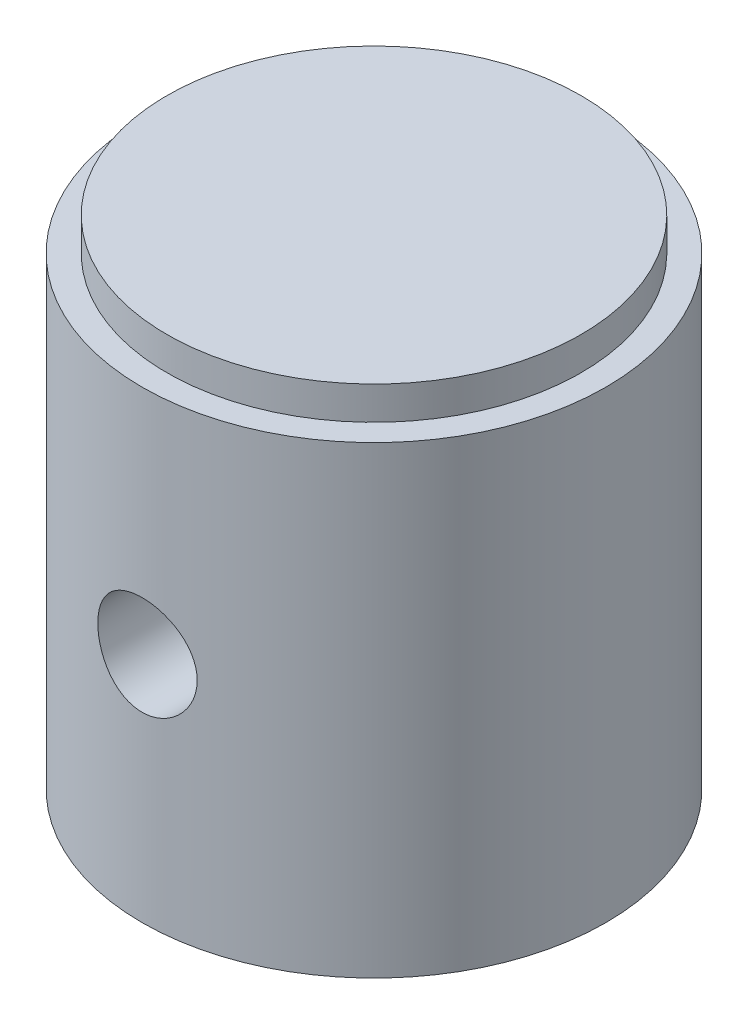
ISO-10303-21;
HEADER;
FILE_DESCRIPTION(('STEP AP214'),'2;1');
FILE_NAME('part.step','',(''),(''),'','','');
FILE_SCHEMA(('AUTOMOTIVE_DESIGN { 1 0 10303 214 1 1 1 1 }'));
ENDSEC;
DATA;
#1=APPLICATION_CONTEXT('core data for automotive mechanical design processes');
#2=APPLICATION_PROTOCOL_DEFINITION('international standard','automotive_design',2000,#1);
#3=PRODUCT_CONTEXT('',#1,'mechanical');
#4=PRODUCT('Part','Part','',(#3));
#5=PRODUCT_RELATED_PRODUCT_CATEGORY('part','',(#4));
#6=PRODUCT_DEFINITION_FORMATION('','',#4);
#7=PRODUCT_DEFINITION_CONTEXT('part definition',#1,'design');
#8=PRODUCT_DEFINITION('design','',#6,#7);
#9=PRODUCT_DEFINITION_SHAPE('','',#8);
#10=(LENGTH_UNIT() NAMED_UNIT(*) SI_UNIT(.MILLI.,.METRE.));
#11=(NAMED_UNIT(*) PLANE_ANGLE_UNIT() SI_UNIT($,.RADIAN.));
#12=(NAMED_UNIT(*) SI_UNIT($,.STERADIAN.) SOLID_ANGLE_UNIT());
#13=UNCERTAINTY_MEASURE_WITH_UNIT(LENGTH_MEASURE(1.E-05),#10,'distance_accuracy_value','');
#14=(GEOMETRIC_REPRESENTATION_CONTEXT(3) GLOBAL_UNCERTAINTY_ASSIGNED_CONTEXT((#13)) GLOBAL_UNIT_ASSIGNED_CONTEXT((#10,
#11,#12)) REPRESENTATION_CONTEXT('',''));
#15=CARTESIAN_POINT('',(0.,0.,0.));
#16=DIRECTION('',(0.,0.,1.));
#17=DIRECTION('',(1.,0.,0.));
#18=AXIS2_PLACEMENT_3D('',#15,#16,#17);
#19=CARTESIAN_POINT('',(9.16749727962461E-07,6.80628912748792,1.67112240708691E-06));
#20=DIRECTION('',(0.,-1.,0.));
#21=DIRECTION('',(0.,0.,-1.));
#22=AXIS2_PLACEMENT_3D('',#19,#20,#21);
#23=CONICAL_SURFACE('',#22,7.125,1.02974425867666);
#24=CARTESIAN_POINT('',(9.16749727962461E-07,11.0874210380593,1.67112240708691E-06));
#25=VERTEX_POINT('',#24);
#26=VERTEX_LOOP('',#25);
#27=FACE_BOUND('',#26,.T.);
#28=CARTESIAN_POINT('',(9.16749727962461E-07,6.80628912748792,1.67112240708691E-06));
#29=DIRECTION('',(0.,-1.,0.));
#30=DIRECTION('',(0.,0.,-1.));
#31=AXIS2_PLACEMENT_3D('',#28,#29,#30);
#32=CIRCLE('',#31,7.125);
#33=CARTESIAN_POINT('',(9.16749727962461E-07,6.80628912748792,-7.12499832887759));
#34=VERTEX_POINT('',#33);
#35=EDGE_CURVE('E68',#34,#34,#32,.T.);
#36=ORIENTED_EDGE('',*,*,#35,.T.);
#37=EDGE_LOOP('',(#36));
#38=FACE_BOUND('',#37,.T.);
#39=ADVANCED_FACE('F47',(#27,#38),#23,.F.);
#40=CARTESIAN_POINT('',(9.1674972860878E-07,12.8062891274879,1.67112240708691E-06));
#41=DIRECTION('',(0.,-1.,0.));
#42=DIRECTION('',(0.,0.,-1.));
#43=AXIS2_PLACEMENT_3D('',#40,#41,#42);
#44=PLANE('',#43);
#45=CARTESIAN_POINT('',(9.16749727962461E-07,12.8062891274879,1.67112240708691E-06));
#46=DIRECTION('',(0.,-1.,0.));
#47=DIRECTION('',(0.,0.,-1.));
#48=AXIS2_PLACEMENT_3D('',#45,#46,#47);
#49=CIRCLE('',#48,9.375);
#50=CARTESIAN_POINT('',(9.16749727962461E-07,12.8062891274879,-9.3749983288776));
#51=VERTEX_POINT('',#50);
#52=EDGE_CURVE('E13',#51,#51,#49,.T.);
#53=ORIENTED_EDGE('',*,*,#52,.F.);
#54=EDGE_LOOP('',(#53));
#55=FACE_BOUND('',#54,.T.);
#56=ADVANCED_FACE('F65',(#55),#44,.F.);
#57=CARTESIAN_POINT('',(9.16749727962461E-07,1.86934394232052,1.67112240708691E-06));
#58=DIRECTION('',(0.,-1.,0.));
#59=DIRECTION('',(0.,0.,-1.));
#60=AXIS2_PLACEMENT_3D('',#57,#58,#59);
#61=CYLINDRICAL_SURFACE('',#60,9.375);
#62=CARTESIAN_POINT('',(9.16749727962461E-07,11.3062891274879,1.67112240708691E-06));
#63=DIRECTION('',(0.,-1.,0.));
#64=DIRECTION('',(0.,0.,-1.));
#65=AXIS2_PLACEMENT_3D('',#62,#63,#64);
#66=CIRCLE('',#65,9.375);
#67=CARTESIAN_POINT('',(9.16749727962461E-07,11.3062891274879,-9.37499832887759));
#68=VERTEX_POINT('',#67);
#69=EDGE_CURVE('E59',#68,#68,#66,.T.);
#70=ORIENTED_EDGE('',*,*,#69,.F.);
#71=EDGE_LOOP('',(#70));
#72=FACE_BOUND('',#71,.T.);
#73=ORIENTED_EDGE('',*,*,#52,.T.);
#74=EDGE_LOOP('',(#73));
#75=FACE_BOUND('',#74,.T.);
#76=ADVANCED_FACE('F125',(#72,#75),#61,.T.);
#77=CARTESIAN_POINT('',(-9.37499908325027,11.3062891274879,1.67112240708691E-06));
#78=DIRECTION('',(0.,-1.,0.));
#79=DIRECTION('',(0.,0.,-1.));
#80=AXIS2_PLACEMENT_3D('',#77,#78,#79);
#81=PLANE('',#80);
#82=CARTESIAN_POINT('',(9.16749727962461E-07,11.3062891274879,1.67112240708691E-06));
#83=DIRECTION('',(0.,-1.,0.));
#84=DIRECTION('',(0.,0.,-1.));
#85=AXIS2_PLACEMENT_3D('',#82,#83,#84);
#86=CIRCLE('',#85,10.5);
#87=CARTESIAN_POINT('',(9.16749727962461E-07,11.3062891274879,-10.4999983288776));
#88=VERTEX_POINT('',#87);
#89=EDGE_CURVE('E90',#88,#88,#86,.T.);
#90=ORIENTED_EDGE('',*,*,#89,.F.);
#91=EDGE_LOOP('',(#90));
#92=FACE_BOUND('',#91,.T.);
#93=ORIENTED_EDGE('',*,*,#69,.T.);
#94=EDGE_LOOP('',(#93));
#95=FACE_BOUND('',#94,.T.);
#96=ADVANCED_FACE('F120',(#92,#95),#81,.F.);
#97=CARTESIAN_POINT('',(9.16749727962461E-07,1.86934394232052,1.67112240708691E-06));
#98=DIRECTION('',(0.,-1.,0.));
#99=DIRECTION('',(0.,0.,-1.));
#100=AXIS2_PLACEMENT_3D('',#97,#98,#99);
#101=CYLINDRICAL_SURFACE('',#100,10.5);
#102=CARTESIAN_POINT('',(9.16749727962461E-07,3.05628912748792,-10.4999983288776));
#103=CARTESIAN_POINT('',(-0.124852912386197,3.05628477812647,-10.499996019526));
#104=CARTESIAN_POINT('',(-0.249759876650684,3.04586171490614,-10.4977487181233));
#105=CARTESIAN_POINT('',(-0.496030099690263,3.00448564220754,-10.4890007762935));
#106=CARTESIAN_POINT('',(-0.617390688607057,2.97351756119552,-10.4824970134341));
#107=CARTESIAN_POINT('',(-0.852973068976877,2.89206258057587,-10.46596080571));
#108=CARTESIAN_POINT('',(-0.967202028420106,2.84159565841594,-10.4559319733852));
#109=CARTESIAN_POINT('',(-1.18556635019145,2.72263799823103,-10.4334299311472));
#110=CARTESIAN_POINT('',(-1.28970205587133,2.65414787361301,-10.4209568044275));
#111=CARTESIAN_POINT('',(-1.48653626905312,2.49996867797766,-10.3947188675723));
#112=CARTESIAN_POINT('',(-1.57905663454195,2.41405479464013,-10.3809385760265));
#113=CARTESIAN_POINT('',(-1.7484897190918,2.22794965396013,-10.3537493760898));
#114=CARTESIAN_POINT('',(-1.8254010905139,2.12775716511104,-10.340340499852));
#115=CARTESIAN_POINT('',(-1.9622121489474,1.91463049819727,-10.315260069586));
#116=CARTESIAN_POINT('',(-2.0219234582754,1.80157285085361,-10.303608374043));
#117=CARTESIAN_POINT('',(-2.12143143861749,1.56673744683767,-10.2835832122556));
#118=CARTESIAN_POINT('',(-2.16123038827601,1.44496068974906,-10.2752093709383));
#119=CARTESIAN_POINT('',(-2.21919769958709,1.19807249760581,-10.2628454627723));
#120=CARTESIAN_POINT('',(-2.23768077947541,1.07303821399213,-10.2587916823249));
#121=CARTESIAN_POINT('',(-2.25347001134893,0.821582778727431,-10.2553354265542));
#122=CARTESIAN_POINT('',(-2.25077865821971,0.695161792218003,-10.2559324032535));
#123=CARTESIAN_POINT('',(-2.22454897836319,0.446852095587235,-10.2616524779351));
#124=CARTESIAN_POINT('',(-2.2013750629914,0.324922793837693,-10.26669645411));
#125=CARTESIAN_POINT('',(-2.13541489773042,0.0867237670539105,-10.2806172295144));
#126=CARTESIAN_POINT('',(-2.09262758729726,-0.0295456515605576,-10.2894942360036));
#127=CARTESIAN_POINT('',(-1.98831734939014,-0.254155181822084,-10.3101595402135));
#128=CARTESIAN_POINT('',(-1.92665324784272,-0.362427641580903,-10.3219696436281));
#129=CARTESIAN_POINT('',(-1.78643919251017,-0.567223619949012,-10.3471569163969));
#130=CARTESIAN_POINT('',(-1.7078870248037,-0.66374559554138,-10.360534291106));
#131=CARTESIAN_POINT('',(-1.53419222458008,-0.844399906022173,-10.3876891047858));
#132=CARTESIAN_POINT('',(-1.43873943419689,-0.928233932389183,-10.4014690884603));
#133=CARTESIAN_POINT('',(-1.23497504265392,-1.07875147304657,-10.4276235913335));
#134=CARTESIAN_POINT('',(-1.12666322641337,-1.14543470041266,-10.4399980870172));
#135=CARTESIAN_POINT('',(-0.899899276325212,-1.25982689237247,-10.4619850068876));
#136=CARTESIAN_POINT('',(-0.781427471545496,-1.30749799137905,-10.4715919085279));
#137=CARTESIAN_POINT('',(-0.537903803278832,-1.3821743449937,-10.4869199675576));
#138=CARTESIAN_POINT('',(-0.412852859950776,-1.40918248135705,-10.4926416667833));
#139=CARTESIAN_POINT('',(-0.162280589505216,-1.44133519372721,-10.4994779240947));
#140=CARTESIAN_POINT('',(-0.0368138491576947,-1.44688744183475,-10.5006783766936));
#141=CARTESIAN_POINT('',(0.213254377225335,-1.43707401582433,-10.4985770629171));
#142=CARTESIAN_POINT('',(0.33785591894061,-1.42170970056767,-10.4952755890131));
#143=CARTESIAN_POINT('',(0.581314723723936,-1.37083750701952,-10.4845954745566));
#144=CARTESIAN_POINT('',(0.700218486112443,-1.33554231830328,-10.4772599045595));
#145=CARTESIAN_POINT('',(0.930418592459854,-1.24604545801985,-10.4593321952002));
#146=CARTESIAN_POINT('',(1.04171430563134,-1.1918422210446,-10.4487397862112));
#147=CARTESIAN_POINT('',(1.25523301369686,-1.06521055792159,-10.4252608947336));
#148=CARTESIAN_POINT('',(1.35730977941644,-0.992541180147486,-10.4123447991917));
#149=CARTESIAN_POINT('',(1.54796630503512,-0.831358635178973,-10.3857138244003));
#150=CARTESIAN_POINT('',(1.63654438478772,-0.742843498680913,-10.3719988460091));
#151=CARTESIAN_POINT('',(1.79929158261956,-0.550614817231373,-10.3450209194725));
#152=CARTESIAN_POINT('',(1.87317897557708,-0.446660723678922,-10.3317702121969));
#153=CARTESIAN_POINT('',(2.00244714754033,-0.227578977795088,-10.3074981472728));
#154=CARTESIAN_POINT('',(2.05782871545531,-0.112451802045839,-10.2964766945984));
#155=CARTESIAN_POINT('',(2.14814703547794,0.125097575979828,-10.2780134759884));
#156=CARTESIAN_POINT('',(2.18319689636885,0.247475162133925,-10.2705519476221));
#157=CARTESIAN_POINT('',(2.23219135802976,0.496562503238377,-10.2600161295039));
#158=CARTESIAN_POINT('',(2.24613917845359,0.623271594289902,-10.2569411704732));
#159=CARTESIAN_POINT('',(2.25240091564034,0.874587642250787,-10.2555676115999));
#160=CARTESIAN_POINT('',(2.24516112562439,0.99918314995879,-10.2571704766557));
#161=CARTESIAN_POINT('',(2.21024775784469,1.2453349906868,-10.26474977665));
#162=CARTESIAN_POINT('',(2.18257440111941,1.36689135656778,-10.2707261642783));
#163=CARTESIAN_POINT('',(2.10779110585623,1.60317711429168,-10.28633204544));
#164=CARTESIAN_POINT('',(2.06074362431303,1.71792710048436,-10.2959497922481));
#165=CARTESIAN_POINT('',(1.94860219068374,1.9379721862482,-10.3177597977373));
#166=CARTESIAN_POINT('',(1.88350644627222,2.04326634541049,-10.329952312083));
#167=CARTESIAN_POINT('',(1.73562527198928,2.24361641807597,-10.3558341627761));
#168=CARTESIAN_POINT('',(1.65252072806828,2.33843367140839,-10.3695479779615));
#169=CARTESIAN_POINT('',(1.47163074867916,2.51292352126861,-10.396760075873));
#170=CARTESIAN_POINT('',(1.37384193082812,2.59259261895623,-10.410258308147));
#171=CARTESIAN_POINT('',(1.1649056376528,2.73546306674627,-10.4357156946124));
#172=CARTESIAN_POINT('',(1.05360818576419,2.79844903683439,-10.447653797437));
#173=CARTESIAN_POINT('',(0.821776158160626,2.9047209208472,-10.4684357204379));
#174=CARTESIAN_POINT('',(0.701249575545548,2.94802366136548,-10.4772821820627));
#175=CARTESIAN_POINT('',(0.483803743079534,3.00581740518465,-10.4892710558042));
#176=CARTESIAN_POINT('',(0.388076725068697,3.02470877845797,-10.4932692072015));
#177=CARTESIAN_POINT('',(0.194910858030498,3.04994608005542,-10.4986336911984));
#178=CARTESIAN_POINT('',(0.0974720793828457,3.05629252295701,-10.5000001317473));
#179=CARTESIAN_POINT('',(9.16749727962461E-07,3.05628912748792,-10.4999983288776));
#180=B_SPLINE_CURVE_WITH_KNOTS('',3,(#102,#103,#104,#105,#106,#107,#108,#109,#110,#111,#112,
#113,#114,#115,#116,#117,#118,#119,#120,#121,#122,#123,#124,#125,#126,#127,#128,#129,#130,#131,
#132,#133,#134,#135,#136,#137,#138,#139,#140,#141,#142,#143,#144,#145,#146,#147,#148,#149,#150,
#151,#152,#153,#154,#155,#156,#157,#158,#159,#160,#161,#162,#163,#164,#165,#166,#167,#168,#169,
#170,#171,#172,#173,#174,#175,#176,#177,#178,#179),.UNSPECIFIED.,.T.,.F.,(4,2,2,2,2,2,2,2,2,2,2,
2,2,2,2,2,2,2,2,2,2,2,2,2,2,2,2,2,2,2,2,2,2,2,2,2,2,2,4),(0.,0.374204754768123,
0.748684324829904,1.1227812366384,1.49686541796883,1.87612442822598,2.2554161687776,
2.63871643821766,3.02197283516235,3.39949512186999,3.77697292753747,4.14786713179391,
4.51878139356852,4.89254034248952,5.26634831881334,5.64790516575436,6.02946839553525,
6.41178781709709,6.79405390884515,7.16901998556277,7.54396170347144,7.91497590883901,
8.28602083797651,8.66218100801704,9.03838795956727,9.42123094925301,9.80405761613708,
10.1847336061271,10.5653515084378,10.9380102081044,11.3106648766241,11.6821274956018,
12.0536270167743,12.4323442523117,12.8111488559567,13.1946286553583,13.5777800101541,
13.8699269869844,14.16206198006),.UNSPECIFIED.);
#181=CARTESIAN_POINT('',(9.16749727962461E-07,3.05628912748792,-10.4999983288776));
#182=VERTEX_POINT('',#181);
#183=EDGE_CURVE('E71',#182,#182,#180,.T.);
#184=ORIENTED_EDGE('',*,*,#183,.T.);
#185=EDGE_LOOP('',(#184));
#186=FACE_BOUND('',#185,.T.);
#187=CARTESIAN_POINT('',(2.25000091674973,0.806289127487923,10.2560974195054));
#188=CARTESIAN_POINT('',(2.24999654032988,0.681472398763402,10.2560999395313));
#189=CARTESIAN_POINT('',(2.2395794604215,0.556602466574315,10.258400756258));
#190=CARTESIAN_POINT('',(2.19822930554446,0.310409119125343,10.2673393475638));
#191=CARTESIAN_POINT('',(2.16728101155399,0.189088404473729,10.2739803392983));
#192=CARTESIAN_POINT('',(2.08588387201879,-0.0464094968734981,10.2908134005253));
#193=CARTESIAN_POINT('',(2.03545593161946,-0.160594189694306,10.3010016620103));
#194=CARTESIAN_POINT('',(1.91659018184982,-0.378883783428961,10.3237767338516));
#195=CARTESIAN_POINT('',(1.84815289748136,-0.482988978055682,10.3363634742854));
#196=CARTESIAN_POINT('',(1.69402805530305,-0.679855314735267,10.3627453530723));
#197=CARTESIAN_POINT('',(1.60810380900947,-0.772429186872021,10.3765554191987));
#198=CARTESIAN_POINT('',(1.42195517894409,-0.941966204120752,10.4036970467783));
#199=CARTESIAN_POINT('',(1.32172971207624,-1.01892816580218,10.4170285718936));
#200=CARTESIAN_POINT('',(1.1085718494466,-1.15579403924923,10.4418732077639));
#201=CARTESIAN_POINT('',(0.995521649094659,-1.215518356168,10.4533666534139));
#202=CARTESIAN_POINT('',(0.760702320763621,-1.31505240968151,10.4730717367664));
#203=CARTESIAN_POINT('',(0.638934132820197,-1.3548642896915,10.4812837276723));
#204=CARTESIAN_POINT('',(0.392081698256996,-1.41285582890909,10.4933951503401));
#205=CARTESIAN_POINT('',(0.267075017645114,-1.43135226534072,10.4973576717982));
#206=CARTESIAN_POINT('',(0.0156743347096955,-1.44717778848196,10.5007421042274));
#207=CARTESIAN_POINT('',(-0.11071951349741,-1.44450920335321,10.5001645146129));
#208=CARTESIAN_POINT('',(-0.359124627126039,-1.4183174255167,10.4945821840608));
#209=CARTESIAN_POINT('',(-0.48117375629344,-1.3951356220772,10.4896499184089));
#210=CARTESIAN_POINT('',(-0.719608279217855,-1.32911884973428,10.475994794959));
#211=CARTESIAN_POINT('',(-0.835993423512853,-1.28628301606247,10.4672717703702));
#212=CARTESIAN_POINT('',(-1.0607503295851,-1.1818686841793,10.4468979908253));
#213=CARTESIAN_POINT('',(-1.16905956877396,-1.12015972170556,10.4352269581816));
#214=CARTESIAN_POINT('',(-1.37391047309454,-0.97984792026668,10.4102385772804));
#215=CARTESIAN_POINT('',(-1.47045059292756,-0.901242866561625,10.3969210132928));
#216=CARTESIAN_POINT('',(-1.65105221525324,-0.727508055720281,10.3697915680363));
#217=CARTESIAN_POINT('',(-1.73482584305403,-0.632079503476524,10.3559751267152));
#218=CARTESIAN_POINT('',(-1.88523273177119,-0.428385944909317,10.329655173602));
#219=CARTESIAN_POINT('',(-1.9518655650213,-0.320120618404204,10.3171516945732));
#220=CARTESIAN_POINT('',(-2.06622024684972,-0.0933741209164369,10.2948620249232));
#221=CARTESIAN_POINT('',(-2.11388960958411,0.0251343132665818,10.285083398039));
#222=CARTESIAN_POINT('',(-2.188551510637,0.268738276407582,10.2694567832217));
#223=CARTESIAN_POINT('',(-2.21554718366969,0.393832803652709,10.2636081993997));
#224=CARTESIAN_POINT('',(-2.24765287362005,0.644432756462495,10.2566248899541));
#225=CARTESIAN_POINT('',(-2.25318121217987,0.76988214010388,10.2554000768979));
#226=CARTESIAN_POINT('',(-2.24332617788587,1.01991011726047,10.2575602647323));
#227=CARTESIAN_POINT('',(-2.2279441794748,1.14448876746825,10.2609449626383));
#228=CARTESIAN_POINT('',(-2.17706750278403,1.38779477995906,10.2718579033855));
#229=CARTESIAN_POINT('',(-2.14180153702358,1.50657227638336,10.2793390002379));
#230=CARTESIAN_POINT('',(-2.05240487745152,1.7365326337873,10.2975595691691));
#231=CARTESIAN_POINT('',(-1.99827243819255,1.84771479093921,10.3082993427151));
#232=CARTESIAN_POINT('',(-1.87175164950085,2.0611436546263,10.3320261823276));
#233=CARTESIAN_POINT('',(-1.79910461211216,2.1632335005062,10.3450441973172));
#234=CARTESIAN_POINT('',(-1.63795684075428,2.35392664629862,10.3717783015245));
#235=CARTESIAN_POINT('',(-1.54945422098269,2.44252833966062,10.3854944736393));
#236=CARTESIAN_POINT('',(-1.35721822988149,2.60534458190506,10.412375270975));
#237=CARTESIAN_POINT('',(-1.25324147199343,2.67927450172344,10.4255257052386));
#238=CARTESIAN_POINT('',(-1.03410130517369,2.8086172415145,10.4495358318459));
#239=CARTESIAN_POINT('',(-0.91893840731588,2.86403090694717,10.4603956287728));
#240=CARTESIAN_POINT('',(-0.681397211723333,2.95436720944564,10.478540846846));
#241=CARTESIAN_POINT('',(-0.559068872863033,2.98941658310734,10.4858483281778));
#242=CARTESIAN_POINT('',(-0.310086848755205,3.0384266860864,10.4961607606522));
#243=CARTESIAN_POINT('',(-0.183433768211256,3.05239035144878,10.499166310807));
#244=CARTESIAN_POINT('',(0.0678964923289659,3.05870510610572,10.5005193362581));
#245=CARTESIAN_POINT('',(0.192562675013551,3.0514818653949,10.4989585561469));
#246=CARTESIAN_POINT('',(0.438860324373691,3.01657698220934,10.4915499565736));
#247=CARTESIAN_POINT('',(0.560491841357735,2.98889567912031,10.4857022082295));
#248=CARTESIAN_POINT('',(0.796953839480553,2.91406091811383,10.4703825006987));
#249=CARTESIAN_POINT('',(0.911803464359199,2.8669655934101,10.4609213675731));
#250=CARTESIAN_POINT('',(1.13202835183485,2.75469722073373,10.439387211889));
#251=CARTESIAN_POINT('',(1.23740273394504,2.68952249502697,10.4273139469525));
#252=CARTESIAN_POINT('',(1.43776937709147,2.54154564937586,10.4015988201143));
#253=CARTESIAN_POINT('',(1.53253646440418,2.4584428900133,10.3879323046446));
#254=CARTESIAN_POINT('',(1.70692593861858,2.27757821210506,10.3607070223559));
#255=CARTESIAN_POINT('',(1.78654468770179,2.17981278242709,10.3471482821658));
#256=CARTESIAN_POINT('',(1.92934984068644,1.97090338773349,10.3214820755379));
#257=CARTESIAN_POINT('',(1.99231438383856,1.85960509015384,10.3093952591077));
#258=CARTESIAN_POINT('',(2.09854598659176,1.6277735462003,10.2882991282064));
#259=CARTESIAN_POINT('',(2.14183001309518,1.50724835963403,10.2792871645331));
#260=CARTESIAN_POINT('',(2.19958002358229,1.28984993069366,10.2670600809911));
#261=CARTESIAN_POINT('',(2.21845220436836,1.19417161392201,10.2629759175062));
#262=CARTESIAN_POINT('',(2.2436640773988,1.00110266012612,10.257493663624));
#263=CARTESIAN_POINT('',(2.2500043326687,0.903712100226694,10.2560954525542));
#264=CARTESIAN_POINT('',(2.25000091674973,0.806289127487923,10.2560974195054));
#265=B_SPLINE_CURVE_WITH_KNOTS('',3,(#187,#188,#189,#190,#191,#192,#193,#194,#195,#196,#197,
#198,#199,#200,#201,#202,#203,#204,#205,#206,#207,#208,#209,#210,#211,#212,#213,#214,#215,#216,
#217,#218,#219,#220,#221,#222,#223,#224,#225,#226,#227,#228,#229,#230,#231,#232,#233,#234,#235,
#236,#237,#238,#239,#240,#241,#242,#243,#244,#245,#246,#247,#248,#249,#250,#251,#252,#253,#254,
#255,#256,#257,#258,#259,#260,#261,#262,#263,#264),.UNSPECIFIED.,.T.,.F.,(4,2,2,2,2,2,2,2,2,2,2,
2,2,2,2,2,2,2,2,2,2,2,2,2,2,2,2,2,2,2,2,2,2,2,2,2,2,2,4),(0.,0.374093223041292,
0.748464057719946,1.12243423672914,1.49639351510292,1.87579844374038,2.25523212169318,
2.63848702230417,3.02170065969401,3.39914262227893,3.77654306665861,4.14777836501057,
4.51902999911375,4.89290832215156,5.26683568308472,5.64823441168942,6.02964265534638,
6.41209931117671,6.79449796430758,7.16940649788784,7.54429038980875,7.91494771124062,
8.28563933344725,8.66182515324476,9.03805574488617,9.42099322024815,9.80391320813312,
10.1844238473656,10.5648814981281,10.9377479946619,11.3106083057265,11.6823601442922,
12.0541464922705,12.4327337124145,12.8114117344685,13.1949057025222,13.5780684242056,
13.8700718418644,14.1620621403007),.UNSPECIFIED.);
#266=CARTESIAN_POINT('',(2.25000091674973,0.806289127487923,10.2560974195054));
#267=VERTEX_POINT('',#266);
#268=EDGE_CURVE('E77',#267,#267,#265,.T.);
#269=ORIENTED_EDGE('',*,*,#268,.T.);
#270=EDGE_LOOP('',(#269));
#271=FACE_BOUND('',#270,.T.);
#272=CARTESIAN_POINT('',(9.16749727962461E-07,-9.69371087251207,1.67112240708691E-06));
#273=DIRECTION('',(0.,-1.,0.));
#274=DIRECTION('',(0.,0.,-1.));
#275=AXIS2_PLACEMENT_3D('',#272,#273,#274);
#276=CIRCLE('',#275,10.5);
#277=CARTESIAN_POINT('',(9.16749727962461E-07,-9.69371087251207,-10.4999983288776));
#278=VERTEX_POINT('',#277);
#279=EDGE_CURVE('E87',#278,#278,#276,.T.);
#280=ORIENTED_EDGE('',*,*,#279,.F.);
#281=EDGE_LOOP('',(#280));
#282=FACE_BOUND('',#281,.T.);
#283=ORIENTED_EDGE('',*,*,#89,.T.);
#284=EDGE_LOOP('',(#283));
#285=FACE_BOUND('',#284,.T.);
#286=ADVANCED_FACE('F114',(#186,#271,#282,#285),#101,.T.);
#287=CARTESIAN_POINT('',(-10.4999990832503,-9.69371087251208,1.67112240708691E-06));
#288=DIRECTION('',(0.,1.,0.));
#289=DIRECTION('',(0.,0.,1.));
#290=AXIS2_PLACEMENT_3D('',#287,#288,#289);
#291=PLANE('',#290);
#292=CARTESIAN_POINT('',(9.16749727962461E-07,-9.69371087251208,1.67112240708691E-06));
#293=DIRECTION('',(0.,-1.,0.));
#294=DIRECTION('',(0.,0.,-1.));
#295=AXIS2_PLACEMENT_3D('',#292,#293,#294);
#296=CIRCLE('',#295,9.375);
#297=CARTESIAN_POINT('',(9.16749727962461E-07,-9.69371087251208,-9.37499832887759));
#298=VERTEX_POINT('',#297);
#299=EDGE_CURVE('E74',#298,#298,#296,.T.);
#300=ORIENTED_EDGE('',*,*,#299,.F.);
#301=EDGE_LOOP('',(#300));
#302=FACE_BOUND('',#301,.T.);
#303=ORIENTED_EDGE('',*,*,#279,.T.);
#304=EDGE_LOOP('',(#303));
#305=FACE_BOUND('',#304,.T.);
#306=ADVANCED_FACE('F119',(#302,#305),#291,.F.);
#307=CARTESIAN_POINT('',(9.16749727962461E-07,-9.69371087251208,1.67112240708691E-06));
#308=DIRECTION('',(0.,-1.,0.));
#309=DIRECTION('',(0.,0.,-1.));
#310=AXIS2_PLACEMENT_3D('',#307,#308,#309);
#311=CONICAL_SURFACE('',#310,9.375,0.349065850398866);
#312=CARTESIAN_POINT('',(9.16749727962461E-07,-3.51188667873919,1.67112240708691E-06));
#313=DIRECTION('',(0.,-1.,0.));
#314=DIRECTION('',(0.,0.,-1.));
#315=AXIS2_PLACEMENT_3D('',#312,#313,#314);
#316=CIRCLE('',#315,7.125);
#317=CARTESIAN_POINT('',(9.16749727962461E-07,-3.51188667873919,-7.12499832887759));
#318=VERTEX_POINT('',#317);
#319=EDGE_CURVE('E70',#318,#318,#316,.T.);
#320=ORIENTED_EDGE('',*,*,#319,.F.);
#321=EDGE_LOOP('',(#320));
#322=FACE_BOUND('',#321,.T.);
#323=ORIENTED_EDGE('',*,*,#299,.T.);
#324=EDGE_LOOP('',(#323));
#325=FACE_BOUND('',#324,.T.);
#326=ADVANCED_FACE('F155',(#322,#325),#311,.F.);
#327=CARTESIAN_POINT('',(9.16749727962461E-07,1.86934394232052,1.67112240708691E-06));
#328=DIRECTION('',(0.,-1.,0.));
#329=DIRECTION('',(0.,0.,-1.));
#330=AXIS2_PLACEMENT_3D('',#327,#328,#329);
#331=CYLINDRICAL_SURFACE('',#330,7.125);
#332=CARTESIAN_POINT('',(9.16749727962461E-07,3.05628912748792,-7.12499832887759));
#333=CARTESIAN_POINT('',(0.123126233846834,3.05628852149227,-7.12499784744681));
#334=CARTESIAN_POINT('',(0.246258161502468,3.04614932324601,-7.12177676292845));
#335=CARTESIAN_POINT('',(0.488917091696973,3.00596945365315,-7.10924305024926));
#336=CARTESIAN_POINT('',(0.608443341938411,2.97592465877202,-7.09992915994116));
#337=CARTESIAN_POINT('',(0.840356821006244,2.89705069321191,-7.07622647668294));
#338=CARTESIAN_POINT('',(0.952754917886153,2.84825096082748,-7.06184563988849));
#339=CARTESIAN_POINT('',(1.16777278556055,2.73337882284489,-7.02949126787107));
#340=CARTESIAN_POINT('',(1.27039094933922,2.66730358523027,-7.0115171437054));
#341=CARTESIAN_POINT('',(1.46616553488148,2.51756812134829,-6.9732489788098));
#342=CARTESIAN_POINT('',(1.55897111558296,2.43346235438275,-6.95290360408641));
#343=CARTESIAN_POINT('',(1.72942205595861,2.25100170730377,-6.91248098240423));
#344=CARTESIAN_POINT('',(1.80706451717488,2.1526441091738,-6.89240378739044));
#345=CARTESIAN_POINT('',(1.94690291955338,1.9414159543141,-6.85423778167536));
#346=CARTESIAN_POINT('',(2.00865784703731,1.8282409223217,-6.83621220872142));
#347=CARTESIAN_POINT('',(2.11211175665826,1.59245043482356,-6.80496376016042));
#348=CARTESIAN_POINT('',(2.15381614926644,1.46983753641991,-6.79173958917079));
#349=CARTESIAN_POINT('',(2.214696378344,1.22261577393376,-6.77212873808297));
#350=CARTESIAN_POINT('',(2.23452407086504,1.09818352587472,-6.76554475087638));
#351=CARTESIAN_POINT('',(2.25312477768945,0.847597780158142,-6.75937424541411));
#352=CARTESIAN_POINT('',(2.25190352582783,0.721444760603095,-6.75978582153248));
#353=CARTESIAN_POINT('',(2.22895027382045,0.476415849229571,-6.76738597093293));
#354=CARTESIAN_POINT('',(2.20805023861156,0.357452053126676,-6.77429963982705));
#355=CARTESIAN_POINT('',(2.1476828868336,0.124814336324023,-6.79367789000872));
#356=CARTESIAN_POINT('',(2.10821355884445,0.0111409901503764,-6.80614307262672));
#357=CARTESIAN_POINT('',(2.01124717801876,-0.20965677432556,-6.8354282182631));
#358=CARTESIAN_POINT('',(1.95349117462174,-0.316658907244301,-6.85231008737675));
#359=CARTESIAN_POINT('',(1.82177074212396,-0.519724109036438,-6.88849845687202));
#360=CARTESIAN_POINT('',(1.74780202812894,-0.615784275813811,-6.90780559765726));
#361=CARTESIAN_POINT('',(1.58168674319543,-0.79893791475983,-6.94776865192089));
#362=CARTESIAN_POINT('',(1.48885435913661,-0.885405966123263,-6.96844551737888));
#363=CARTESIAN_POINT('',(1.28974971764652,-1.04170073291723,-7.00802671800952));
#364=CARTESIAN_POINT('',(1.1834764229341,-1.11152616277869,-7.02693091618307));
#365=CARTESIAN_POINT('',(0.959282783206085,-1.23298943922424,-7.06104257966566));
#366=CARTESIAN_POINT('',(0.841275021594067,-1.28447529154867,-7.07621884174173));
#367=CARTESIAN_POINT('',(0.597682326287235,-1.36667803921504,-7.10093927547312));
#368=CARTESIAN_POINT('',(0.472099757287414,-1.39740137999668,-7.11048519487468));
#369=CARTESIAN_POINT('',(0.222228829751321,-1.4361350612208,-7.12258685972038));
#370=CARTESIAN_POINT('',(0.0980840986792133,-1.4449918212156,-7.12540295985025));
#371=CARTESIAN_POINT('',(-0.149932617470903,-1.44213119638753,-7.12449936577098));
#372=CARTESIAN_POINT('',(-0.273804640556845,-1.43041688781905,-7.12078064879638));
#373=CARTESIAN_POINT('',(-0.51447599292843,-1.38742473768597,-7.10739648079869));
#374=CARTESIAN_POINT('',(-0.631375113171315,-1.35665298559295,-7.09788496849641));
#375=CARTESIAN_POINT('',(-0.858316440877181,-1.27703931280751,-7.07403158798178));
#376=CARTESIAN_POINT('',(-0.968357794304642,-1.22819514669124,-7.05968911956267));
#377=CARTESIAN_POINT('',(-1.1814836550855,-1.11247623741652,-7.02720504161247));
#378=CARTESIAN_POINT('',(-1.28432923174333,-1.04518598690247,-7.0089783531022));
#379=CARTESIAN_POINT('',(-1.47755143063216,-0.894981890822973,-6.97080746933548));
#380=CARTESIAN_POINT('',(-1.56792459148633,-0.812063723200929,-6.95086279978472));
#381=CARTESIAN_POINT('',(-1.73743915009985,-0.628975977398098,-6.91048556863142));
#382=CARTESIAN_POINT('',(-1.81597708876197,-0.528243531654898,-6.89006598220109));
#383=CARTESIAN_POINT('',(-1.95509168320593,-0.314585814696957,-6.8518929259074));
#384=CARTESIAN_POINT('',(-2.01566856656111,-0.201660697992689,-6.83413942226516));
#385=CARTESIAN_POINT('',(-2.116777314631,0.0329820508088739,-6.80350277249998));
#386=CARTESIAN_POINT('',(-2.15738187879502,0.154665917874307,-6.79060200334422));
#387=CARTESIAN_POINT('',(-2.21737366460595,0.403636327671866,-6.77125285591844));
#388=CARTESIAN_POINT('',(-2.23676918191779,0.530920659570085,-6.76480195494427));
#389=CARTESIAN_POINT('',(-2.25318839233629,0.78115951638323,-6.75934958069228));
#390=CARTESIAN_POINT('',(-2.25120379451989,0.904042567485595,-6.76001786964445));
#391=CARTESIAN_POINT('',(-2.22732033117645,1.14763161431732,-6.76792413221822));
#392=CARTESIAN_POINT('',(-2.20542243183409,1.26833771538157,-6.77516178709702));
#393=CARTESIAN_POINT('',(-2.14300393218429,1.5023318336617,-6.79515811544998));
#394=CARTESIAN_POINT('',(-2.10277284293483,1.61570498667045,-6.80783078450562));
#395=CARTESIAN_POINT('',(-2.00505883798498,1.83418212117112,-6.8372457126221));
#396=CARTESIAN_POINT('',(-1.94757236025853,1.93928438964662,-6.85398881180517));
#397=CARTESIAN_POINT('',(-1.81430218520717,2.14276924543421,-6.89049009575999));
#398=CARTESIAN_POINT('',(-1.73788085268425,2.24071738989052,-6.91034181641375));
#399=CARTESIAN_POINT('',(-1.57002544423112,2.42272038393396,-6.95039954697462));
#400=CARTESIAN_POINT('',(-1.47858731875399,2.50677147362862,-6.97060565113112));
#401=CARTESIAN_POINT('',(-1.2795985728862,2.66142451394556,-7.0099099743119));
#402=CARTESIAN_POINT('',(-1.17160981852311,2.73147971358242,-7.02894816043816));
#403=CARTESIAN_POINT('',(-0.94478829251456,2.85235165404441,-7.06300901752266));
#404=CARTESIAN_POINT('',(-0.825959581208336,2.9031755619398,-7.07803318380112));
#405=CARTESIAN_POINT('',(-0.590452955716995,2.98068728114276,-7.10139797508885));
#406=CARTESIAN_POINT('',(-0.474336783029928,3.00895494686631,-7.11017023654159));
#407=CARTESIAN_POINT('',(-0.23881503717612,3.04675417148459,-7.121970035994));
#408=CARTESIAN_POINT('',(-0.119410169084399,3.05628971520295,-7.1249987957854));
#409=CARTESIAN_POINT('',(9.16749727962461E-07,3.05628912748792,-7.12499832887759));
#410=B_SPLINE_CURVE_WITH_KNOTS('',3,(#332,#333,#334,#335,#336,#337,#338,#339,#340,#341,#342,
#343,#344,#345,#346,#347,#348,#349,#350,#351,#352,#353,#354,#355,#356,#357,#358,#359,#360,#361,
#362,#363,#364,#365,#366,#367,#368,#369,#370,#371,#372,#373,#374,#375,#376,#377,#378,#379,#380,
#381,#382,#383,#384,#385,#386,#387,#388,#389,#390,#391,#392,#393,#394,#395,#396,#397,#398,#399,
#400,#401,#402,#403,#404,#405,#406,#407,#408,#409),.UNSPECIFIED.,.T.,.F.,(4,2,2,2,2,2,2,2,2,2,2,
2,2,2,2,2,2,2,2,2,2,2,2,2,2,2,2,2,2,2,2,2,2,2,2,2,2,2,4),(0.,0.368936956279035,
0.737950363426831,1.10638690651349,1.4748838862292,1.85383074912876,2.23284997766309,
2.62146853564894,3.00998216918917,3.38657747436771,3.76307019477174,4.12432817725207,
4.48562530009869,4.85228645746297,5.2190446376417,5.60287271109721,5.98673042397576,
6.37369924387384,6.76054787930612,7.13216952810688,7.50373560831266,7.86583408590447,
8.22797756787321,8.59906486784471,8.97025494671013,9.3564849882041,9.74271013580861,
10.1275188197047,10.5121769363906,10.8790726445808,11.2459505521015,11.6072255414006,
11.9685751599655,12.3443187866269,12.7201639061633,13.1086368233147,13.4969648224154,
13.8548484674225,14.2126559727536),.UNSPECIFIED.);
#411=CARTESIAN_POINT('',(9.16749727962461E-07,3.05628912748792,-7.12499832887759));
#412=VERTEX_POINT('',#411);
#413=EDGE_CURVE('E50',#412,#412,#410,.T.);
#414=ORIENTED_EDGE('',*,*,#413,.T.);
#415=EDGE_LOOP('',(#414));
#416=FACE_BOUND('',#415,.T.);
#417=CARTESIAN_POINT('',(2.25000091674973,0.806289127487923,6.76041031261738));
#418=CARTESIAN_POINT('',(2.25000028681746,0.929241551502135,6.76041091385443));
#419=CARTESIAN_POINT('',(2.23988852022496,1.05220060307504,6.76380123423368));
#420=CARTESIAN_POINT('',(2.19982749005614,1.2945016417371,6.77693465918956));
#421=CARTESIAN_POINT('',(2.16987319871852,1.41384270407195,6.78667937385282));
#422=CARTESIAN_POINT('',(2.09126354203859,1.64536243176222,6.81131019293134));
#423=CARTESIAN_POINT('',(2.0426418098109,1.75755355770519,6.8261870459134));
#424=CARTESIAN_POINT('',(1.92819011653328,1.9722182114949,6.85939295103611));
#425=CARTESIAN_POINT('',(1.86235699427611,2.07468994946987,6.87772263718385));
#426=CARTESIAN_POINT('',(1.71287769131889,2.27060213466601,6.91649017815421));
#427=CARTESIAN_POINT('',(1.62873137415605,2.36365147309179,6.93697655461121));
#428=CARTESIAN_POINT('',(1.44608404971533,2.53458065672318,6.97733673751967));
#429=CARTESIAN_POINT('',(1.34758099710038,2.61245833679339,6.99721045619907));
#430=CARTESIAN_POINT('',(1.13619817180233,2.752566886676,7.03466215986096));
#431=CARTESIAN_POINT('',(1.02303841833394,2.81439389504295,7.0521763643072));
#432=CARTESIAN_POINT('',(0.787279017885065,2.91798501332479,7.08236826636577));
#433=CARTESIAN_POINT('',(0.664681647581366,2.95975394444715,7.09504712606218));
#434=CARTESIAN_POINT('',(0.417623080489941,3.0207342241396,7.11379629387362));
#435=CARTESIAN_POINT('',(0.293342043464897,3.04061427967201,7.12006207073688));
#436=CARTESIAN_POINT('',(0.0430610096651727,3.05937238363427,7.1259699892269));
#437=CARTESIAN_POINT('',(-0.0829385815544073,3.05825530425303,7.12561366744996));
#438=CARTESIAN_POINT('',(-0.328369512278061,3.03548832815411,7.11845308137487));
#439=CARTESIAN_POINT('',(-0.447875825720048,3.01456355291268,7.11187653461024));
#440=CARTESIAN_POINT('',(-0.681584550882505,2.95396639101225,7.09329541341432));
#441=CARTESIAN_POINT('',(-0.795786613754108,2.9142927731953,7.08129048252602));
#442=CARTESIAN_POINT('',(-1.01730456226281,2.81686485466082,7.05289822451966));
#443=CARTESIAN_POINT('',(-1.1245176031937,2.75889263597447,7.03645844511709));
#444=CARTESIAN_POINT('',(-1.32791773681892,2.6266886556067,7.00092541913445));
#445=CARTESIAN_POINT('',(-1.42410198685211,2.55245271625263,6.98183149124296));
#446=CARTESIAN_POINT('',(-1.60703664486299,2.38611617813754,6.94206151700884));
#447=CARTESIAN_POINT('',(-1.69321216286861,2.29339027641667,6.92135271955016));
#448=CARTESIAN_POINT('',(-1.84896359907547,2.09461188901158,6.88138505783744));
#449=CARTESIAN_POINT('',(-1.91853747489701,1.98855776610051,6.86212637217942));
#450=CARTESIAN_POINT('',(-2.03979866361875,1.76447896976389,6.82707203171778));
#451=CARTESIAN_POINT('',(-2.0912685377936,1.64632941965942,6.81131925836741));
#452=CARTESIAN_POINT('',(-2.17339921998422,1.4024219750137,6.78556215425633));
#453=CARTESIAN_POINT('',(-2.20406769280014,1.2766669015429,6.77555570632593));
#454=CARTESIAN_POINT('',(-2.24260651294867,1.02663558698105,6.76289557829917));
#455=CARTESIAN_POINT('',(-2.2513589125818,0.902509621964148,6.75995761533634));
#456=CARTESIAN_POINT('',(-2.2482967927296,0.654552553543825,6.76097698302908));
#457=CARTESIAN_POINT('',(-2.23648553406037,0.530721406508503,6.76493322045905));
#458=CARTESIAN_POINT('',(-2.19342035222479,0.290699095640279,6.77901412099551));
#459=CARTESIAN_POINT('',(-2.16275487111986,0.17439024648711,6.78895190889797));
#460=CARTESIAN_POINT('',(-2.08354493354533,-0.0514167712299043,6.81367700387582));
#461=CARTESIAN_POINT('',(-2.03499752056516,-0.160913810061306,6.82846511283509));
#462=CARTESIAN_POINT('',(-1.91978719526409,-0.37352342809445,6.86175975862484));
#463=CARTESIAN_POINT('',(-1.8526372964666,-0.47635671492289,6.88036215388564));
#464=CARTESIAN_POINT('',(-1.70269406349501,-0.669616441149903,6.91899283540011));
#465=CARTESIAN_POINT('',(-1.61989658020927,-0.760039578872169,6.9390214989631));
#466=CARTESIAN_POINT('',(-1.43682813954696,-0.929873537424068,6.97927687295005));
#467=CARTESIAN_POINT('',(-1.33596458091492,-1.0086538468447,6.99947589105702));
#468=CARTESIAN_POINT('',(-1.1219591241962,-1.14819783479907,7.03694800807482));
#469=CARTESIAN_POINT('',(-1.00881777302004,-1.2089623153928,7.05422123722633));
#470=CARTESIAN_POINT('',(-0.774148015926543,-1.31016941630952,7.083799201745));
#471=CARTESIAN_POINT('',(-0.652687005399986,-1.35075742018886,7.0961393526614));
#472=CARTESIAN_POINT('',(-0.404203182488074,-1.41079043902657,7.11461623122256));
#473=CARTESIAN_POINT('',(-0.277182164753815,-1.43024222470995,7.12075494537625));
#474=CARTESIAN_POINT('',(-0.0269820561320097,-1.44689132741087,7.12600281871126));
#475=CARTESIAN_POINT('',(0.0961311709805234,-1.44499847658461,7.12539937805606));
#476=CARTESIAN_POINT('',(0.340205748194275,-1.42121905450801,7.11792210616659));
#477=CARTESIAN_POINT('',(0.461167243121042,-1.3993338341045,7.11104869858224));
#478=CARTESIAN_POINT('',(0.695955671896476,-1.33677428259775,7.09189704168514));
#479=CARTESIAN_POINT('',(0.809854925911193,-1.29634797339068,7.07969023562712));
#480=CARTESIAN_POINT('',(1.02930743452433,-1.19807858762016,7.05113008806325));
#481=CARTESIAN_POINT('',(1.134859239419,-1.14023249410829,7.03477602836827));
#482=CARTESIAN_POINT('',(1.33857415182063,-1.00646489330187,6.99892423156012));
#483=CARTESIAN_POINT('',(1.43635799615051,-0.929989865403591,6.97933767903441));
#484=CARTESIAN_POINT('',(1.61800606320933,-0.76210605376439,6.93947924065267));
#485=CARTESIAN_POINT('',(1.70186606312903,-0.670692756177971,6.91920714912259));
#486=CARTESIAN_POINT('',(1.85617010233211,-0.471798708353873,6.879451912119));
#487=CARTESIAN_POINT('',(1.92606025410341,-0.363876925124973,6.86001911636881));
#488=CARTESIAN_POINT('',(2.04663932948978,-0.137231787431077,6.82501884756296));
#489=CARTESIAN_POINT('',(2.09733561248449,-0.0185125946445526,6.80944989381001));
#490=CARTESIAN_POINT('',(2.17462442430294,0.216708806344783,6.78514366936629));
#491=CARTESIAN_POINT('',(2.20280614779657,0.332643796274776,6.77596348300466));
#492=CARTESIAN_POINT('',(2.24049227165444,0.567814066266783,6.76359729225262));
#493=CARTESIAN_POINT('',(2.25000152766515,0.687048480155499,6.76040972953091));
#494=CARTESIAN_POINT('',(2.25000091674973,0.806289127487923,6.76041031261738));
#495=B_SPLINE_CURVE_WITH_KNOTS('',3,(#417,#418,#419,#420,#421,#422,#423,#424,#425,#426,#427,
#428,#429,#430,#431,#432,#433,#434,#435,#436,#437,#438,#439,#440,#441,#442,#443,#444,#445,#446,
#447,#448,#449,#450,#451,#452,#453,#454,#455,#456,#457,#458,#459,#460,#461,#462,#463,#464,#465,
#466,#467,#468,#469,#470,#471,#472,#473,#474,#475,#476,#477,#478,#479,#480,#481,#482,#483,#484,
#485,#486,#487,#488,#489,#490,#491,#492,#493,#494),.UNSPECIFIED.,.T.,.F.,(4,2,2,2,2,2,2,2,2,2,2,
2,2,2,2,2,2,2,2,2,2,2,2,2,2,2,2,2,2,2,2,2,2,2,2,2,2,2,4),(0.,0.368416635868909,
0.736926658028676,1.10477582826865,1.47269260870136,1.85231600946379,2.23199354636009,
2.62045867345783,3.00883038135359,3.38497640370905,3.76103514597346,4.12383870019151,
4.48666608151025,4.85398865403346,5.22140569180914,5.6044425203106,5.98752644679031,
6.37506578961951,6.76246225612876,7.13399680232382,7.50547243898702,7.86590462139821,
8.22639642266008,8.59740060479462,8.96850330073329,9.35536120904717,9.74220189196121,
10.1262132212911,10.5101015010624,10.8776903298101,11.2452543231083,11.6080387530619,
11.9708860501539,12.3462199054643,12.7216673845383,13.1098958382165,13.4979752848818,
13.8553628414338,14.2126574495008),.UNSPECIFIED.);
#496=CARTESIAN_POINT('',(2.25000091674973,0.806289127487923,6.76041031261738));
#497=VERTEX_POINT('',#496);
#498=EDGE_CURVE('E94',#497,#497,#495,.T.);
#499=ORIENTED_EDGE('',*,*,#498,.T.);
#500=EDGE_LOOP('',(#499));
#501=FACE_BOUND('',#500,.T.);
#502=ORIENTED_EDGE('',*,*,#35,.F.);
#503=EDGE_LOOP('',(#502));
#504=FACE_BOUND('',#503,.T.);
#505=ORIENTED_EDGE('',*,*,#319,.T.);
#506=EDGE_LOOP('',(#505));
#507=FACE_BOUND('',#506,.T.);
#508=ADVANCED_FACE('F99',(#416,#501,#504,#507),#331,.F.);
#509=CARTESIAN_POINT('',(9.16749727962461E-07,0.806289127487923,-10.4999983288776));
#510=DIRECTION('',(0.,0.,1.));
#511=DIRECTION('',(1.,0.,0.));
#512=AXIS2_PLACEMENT_3D('',#509,#510,#511);
#513=CYLINDRICAL_SURFACE('',#512,2.25);
#514=ORIENTED_EDGE('',*,*,#498,.F.);
#515=EDGE_LOOP('',(#514));
#516=FACE_BOUND('',#515,.T.);
#517=ORIENTED_EDGE('',*,*,#268,.F.);
#518=EDGE_LOOP('',(#517));
#519=FACE_BOUND('',#518,.T.);
#520=ADVANCED_FACE('F105',(#516,#519),#513,.F.);
#521=ORIENTED_EDGE('',*,*,#413,.F.);
#522=EDGE_LOOP('',(#521));
#523=FACE_BOUND('',#522,.T.);
#524=ORIENTED_EDGE('',*,*,#183,.F.);
#525=EDGE_LOOP('',(#524));
#526=FACE_BOUND('',#525,.T.);
#527=ADVANCED_FACE('F102',(#523,#526),#513,.F.);
#528=CLOSED_SHELL('',(#39,#56,#76,#96,#286,#306,#326,#508,#520,#527));
#529=MANIFOLD_SOLID_BREP('B2',#528);
#530=ADVANCED_BREP_SHAPE_REPRESENTATION('',(#18,#529),#14);
#531=SHAPE_DEFINITION_REPRESENTATION(#9,#530);
ENDSEC;
END-ISO-10303-21;
